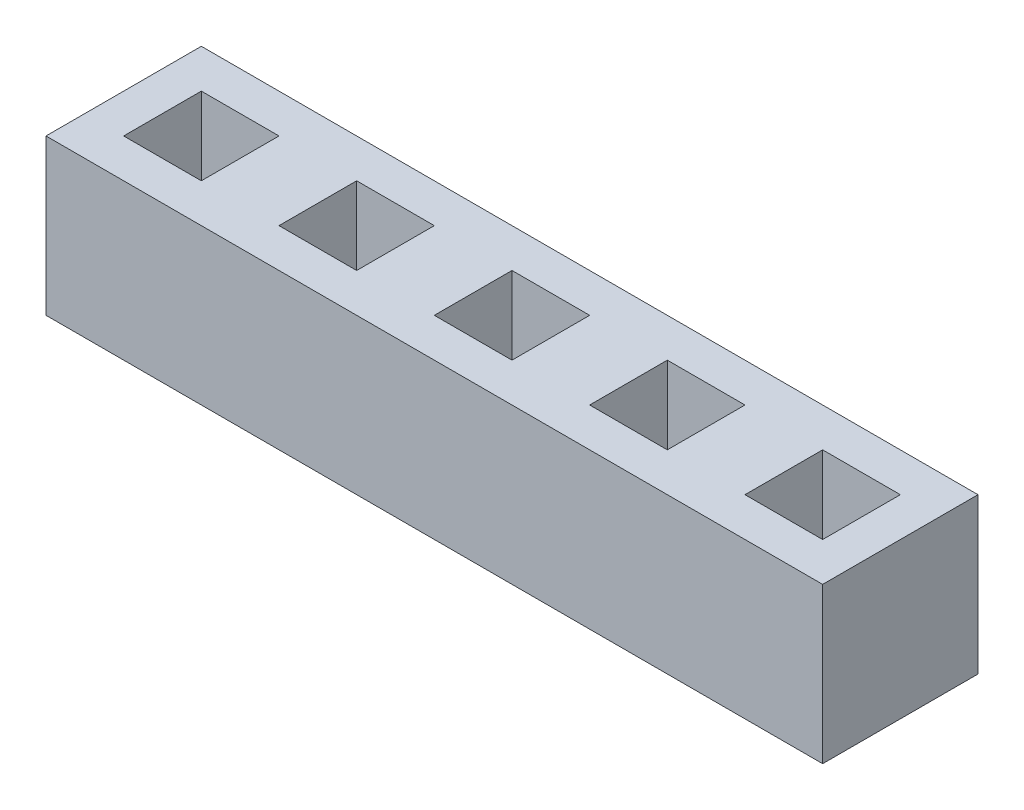
ISO-10303-21;
HEADER;
FILE_DESCRIPTION(('STEP AP214'),'2;1');
FILE_NAME('part.step','',(''),(''),'','','');
FILE_SCHEMA(('AUTOMOTIVE_DESIGN { 1 0 10303 214 1 1 1 1 }'));
ENDSEC;
DATA;
#1=APPLICATION_CONTEXT('core data for automotive mechanical design processes');
#2=APPLICATION_PROTOCOL_DEFINITION('international standard','automotive_design',2000,#1);
#3=PRODUCT_CONTEXT('',#1,'mechanical');
#4=PRODUCT('Part','Part','',(#3));
#5=PRODUCT_RELATED_PRODUCT_CATEGORY('part','',(#4));
#6=PRODUCT_DEFINITION_FORMATION('','',#4);
#7=PRODUCT_DEFINITION_CONTEXT('part definition',#1,'design');
#8=PRODUCT_DEFINITION('design','',#6,#7);
#9=PRODUCT_DEFINITION_SHAPE('','',#8);
#10=(LENGTH_UNIT() NAMED_UNIT(*) SI_UNIT(.MILLI.,.METRE.));
#11=(NAMED_UNIT(*) PLANE_ANGLE_UNIT() SI_UNIT($,.RADIAN.));
#12=(NAMED_UNIT(*) SI_UNIT($,.STERADIAN.) SOLID_ANGLE_UNIT());
#13=UNCERTAINTY_MEASURE_WITH_UNIT(LENGTH_MEASURE(1.E-05),#10,'distance_accuracy_value','');
#14=(GEOMETRIC_REPRESENTATION_CONTEXT(3) GLOBAL_UNCERTAINTY_ASSIGNED_CONTEXT((#13)) GLOBAL_UNIT_ASSIGNED_CONTEXT((#10,
#11,#12)) REPRESENTATION_CONTEXT('',''));
#15=CARTESIAN_POINT('',(0.,0.,0.));
#16=DIRECTION('',(0.,0.,1.));
#17=DIRECTION('',(1.,0.,0.));
#18=AXIS2_PLACEMENT_3D('',#15,#16,#17);
#19=CARTESIAN_POINT('',(0.,2.54,-2.54));
#20=DIRECTION('',(0.,-1.,0.));
#21=DIRECTION('',(0.,0.,-1.));
#22=AXIS2_PLACEMENT_3D('',#19,#20,#21);
#23=PLANE('',#22);
#24=DIRECTION('',(0.,0.,1.));
#25=VECTOR('',#24,1.);
#26=CARTESIAN_POINT('',(8.255,2.54,-1.905));
#27=LINE('',#26,#25);
#28=CARTESIAN_POINT('',(8.255,2.54,-1.905));
#29=VERTEX_POINT('',#28);
#30=CARTESIAN_POINT('',(8.255,2.54,-0.635));
#31=VERTEX_POINT('',#30);
#32=EDGE_CURVE('E229',#29,#31,#27,.T.);
#33=ORIENTED_EDGE('',*,*,#32,.F.);
#34=DIRECTION('',(-1.,0.,0.));
#35=VECTOR('',#34,1.);
#36=CARTESIAN_POINT('',(8.255,2.54,-1.905));
#37=LINE('',#36,#35);
#38=CARTESIAN_POINT('',(9.525,2.54,-1.905));
#39=VERTEX_POINT('',#38);
#40=EDGE_CURVE('E237',#39,#29,#37,.T.);
#41=ORIENTED_EDGE('',*,*,#40,.F.);
#42=DIRECTION('',(0.,0.,-1.));
#43=VECTOR('',#42,1.);
#44=CARTESIAN_POINT('',(9.525,2.54,-1.905));
#45=LINE('',#44,#43);
#46=CARTESIAN_POINT('',(9.525,2.54,-0.635));
#47=VERTEX_POINT('',#46);
#48=EDGE_CURVE('E234',#47,#39,#45,.T.);
#49=ORIENTED_EDGE('',*,*,#48,.F.);
#50=DIRECTION('',(1.,0.,0.));
#51=VECTOR('',#50,1.);
#52=CARTESIAN_POINT('',(8.255,2.54,-0.635));
#53=LINE('',#52,#51);
#54=EDGE_CURVE('E231',#31,#47,#53,.T.);
#55=ORIENTED_EDGE('',*,*,#54,.F.);
#56=EDGE_LOOP('',(#33,#41,#49,#55));
#57=FACE_BOUND('',#56,.T.);
#58=DIRECTION('',(0.,0.,1.));
#59=VECTOR('',#58,1.);
#60=CARTESIAN_POINT('',(3.175,2.54,-1.905));
#61=LINE('',#60,#59);
#62=CARTESIAN_POINT('',(3.175,2.54,-1.905));
#63=VERTEX_POINT('',#62);
#64=CARTESIAN_POINT('',(3.175,2.54,-0.635));
#65=VERTEX_POINT('',#64);
#66=EDGE_CURVE('E291',#63,#65,#61,.T.);
#67=ORIENTED_EDGE('',*,*,#66,.F.);
#68=DIRECTION('',(-1.,0.,0.));
#69=VECTOR('',#68,1.);
#70=CARTESIAN_POINT('',(3.175,2.54,-1.905));
#71=LINE('',#70,#69);
#72=CARTESIAN_POINT('',(4.445,2.54,-1.905));
#73=VERTEX_POINT('',#72);
#74=EDGE_CURVE('E299',#73,#63,#71,.T.);
#75=ORIENTED_EDGE('',*,*,#74,.F.);
#76=DIRECTION('',(0.,0.,-1.));
#77=VECTOR('',#76,1.);
#78=CARTESIAN_POINT('',(4.445,2.54,-1.905));
#79=LINE('',#78,#77);
#80=CARTESIAN_POINT('',(4.445,2.54,-0.635));
#81=VERTEX_POINT('',#80);
#82=EDGE_CURVE('E296',#81,#73,#79,.T.);
#83=ORIENTED_EDGE('',*,*,#82,.F.);
#84=DIRECTION('',(1.,0.,0.));
#85=VECTOR('',#84,1.);
#86=CARTESIAN_POINT('',(3.175,2.54,-0.635));
#87=LINE('',#86,#85);
#88=EDGE_CURVE('E293',#65,#81,#87,.T.);
#89=ORIENTED_EDGE('',*,*,#88,.F.);
#90=EDGE_LOOP('',(#67,#75,#83,#89));
#91=FACE_BOUND('',#90,.T.);
#92=DIRECTION('',(0.,0.,1.));
#93=VECTOR('',#92,1.);
#94=CARTESIAN_POINT('',(0.,2.54,0.));
#95=LINE('',#94,#93);
#96=CARTESIAN_POINT('',(0.,2.54,-2.54));
#97=VERTEX_POINT('',#96);
#98=CARTESIAN_POINT('',(0.,2.54,0.));
#99=VERTEX_POINT('',#98);
#100=EDGE_CURVE('E353',#97,#99,#95,.T.);
#101=ORIENTED_EDGE('',*,*,#100,.T.);
#102=DIRECTION('',(1.,0.,0.));
#103=VECTOR('',#102,1.);
#104=CARTESIAN_POINT('',(0.,2.54,0.));
#105=LINE('',#104,#103);
#106=CARTESIAN_POINT('',(12.7,2.54,0.));
#107=VERTEX_POINT('',#106);
#108=EDGE_CURVE('E356',#99,#107,#105,.T.);
#109=ORIENTED_EDGE('',*,*,#108,.T.);
#110=DIRECTION('',(0.,0.,-1.));
#111=VECTOR('',#110,1.);
#112=CARTESIAN_POINT('',(12.7,2.54,0.));
#113=LINE('',#112,#111);
#114=CARTESIAN_POINT('',(12.7,2.54,-2.54));
#115=VERTEX_POINT('',#114);
#116=EDGE_CURVE('E359',#107,#115,#113,.T.);
#117=ORIENTED_EDGE('',*,*,#116,.T.);
#118=DIRECTION('',(-1.,0.,0.));
#119=VECTOR('',#118,1.);
#120=CARTESIAN_POINT('',(0.,2.54,-2.54));
#121=LINE('',#120,#119);
#122=EDGE_CURVE('E361',#115,#97,#121,.T.);
#123=ORIENTED_EDGE('',*,*,#122,.T.);
#124=EDGE_LOOP('',(#101,#109,#117,#123));
#125=FACE_BOUND('',#124,.T.);
#126=DIRECTION('',(0.,0.,1.));
#127=VECTOR('',#126,1.);
#128=CARTESIAN_POINT('',(0.635,2.54,-1.905));
#129=LINE('',#128,#127);
#130=CARTESIAN_POINT('',(0.635,2.54,-1.905));
#131=VERTEX_POINT('',#130);
#132=CARTESIAN_POINT('',(0.635,2.54,-0.635));
#133=VERTEX_POINT('',#132);
#134=EDGE_CURVE('E322',#131,#133,#129,.T.);
#135=ORIENTED_EDGE('',*,*,#134,.F.);
#136=DIRECTION('',(-1.,0.,0.));
#137=VECTOR('',#136,1.);
#138=CARTESIAN_POINT('',(0.635,2.54,-1.905));
#139=LINE('',#138,#137);
#140=CARTESIAN_POINT('',(1.905,2.54,-1.905));
#141=VERTEX_POINT('',#140);
#142=EDGE_CURVE('E330',#141,#131,#139,.T.);
#143=ORIENTED_EDGE('',*,*,#142,.F.);
#144=DIRECTION('',(0.,0.,-1.));
#145=VECTOR('',#144,1.);
#146=CARTESIAN_POINT('',(1.905,2.54,-1.905));
#147=LINE('',#146,#145);
#148=CARTESIAN_POINT('',(1.905,2.54,-0.635));
#149=VERTEX_POINT('',#148);
#150=EDGE_CURVE('E327',#149,#141,#147,.T.);
#151=ORIENTED_EDGE('',*,*,#150,.F.);
#152=DIRECTION('',(1.,0.,0.));
#153=VECTOR('',#152,1.);
#154=CARTESIAN_POINT('',(0.635,2.54,-0.635));
#155=LINE('',#154,#153);
#156=EDGE_CURVE('E324',#133,#149,#155,.T.);
#157=ORIENTED_EDGE('',*,*,#156,.F.);
#158=EDGE_LOOP('',(#135,#143,#151,#157));
#159=FACE_BOUND('',#158,.T.);
#160=DIRECTION('',(0.,0.,1.));
#161=VECTOR('',#160,1.);
#162=CARTESIAN_POINT('',(5.715,2.54,-1.905));
#163=LINE('',#162,#161);
#164=CARTESIAN_POINT('',(5.715,2.54,-1.905));
#165=VERTEX_POINT('',#164);
#166=CARTESIAN_POINT('',(5.715,2.54,-0.635));
#167=VERTEX_POINT('',#166);
#168=EDGE_CURVE('E260',#165,#167,#163,.T.);
#169=ORIENTED_EDGE('',*,*,#168,.F.);
#170=DIRECTION('',(-1.,0.,0.));
#171=VECTOR('',#170,1.);
#172=CARTESIAN_POINT('',(5.715,2.54,-1.905));
#173=LINE('',#172,#171);
#174=CARTESIAN_POINT('',(6.985,2.54,-1.905));
#175=VERTEX_POINT('',#174);
#176=EDGE_CURVE('E268',#175,#165,#173,.T.);
#177=ORIENTED_EDGE('',*,*,#176,.F.);
#178=DIRECTION('',(0.,0.,-1.));
#179=VECTOR('',#178,1.);
#180=CARTESIAN_POINT('',(6.985,2.54,-1.905));
#181=LINE('',#180,#179);
#182=CARTESIAN_POINT('',(6.985,2.54,-0.635));
#183=VERTEX_POINT('',#182);
#184=EDGE_CURVE('E265',#183,#175,#181,.T.);
#185=ORIENTED_EDGE('',*,*,#184,.F.);
#186=DIRECTION('',(1.,0.,0.));
#187=VECTOR('',#186,1.);
#188=CARTESIAN_POINT('',(5.715,2.54,-0.635));
#189=LINE('',#188,#187);
#190=EDGE_CURVE('E262',#167,#183,#189,.T.);
#191=ORIENTED_EDGE('',*,*,#190,.F.);
#192=EDGE_LOOP('',(#169,#177,#185,#191));
#193=FACE_BOUND('',#192,.T.);
#194=DIRECTION('',(0.,0.,1.));
#195=VECTOR('',#194,1.);
#196=CARTESIAN_POINT('',(10.795,2.54,-1.905));
#197=LINE('',#196,#195);
#198=CARTESIAN_POINT('',(10.795,2.54,-1.905));
#199=VERTEX_POINT('',#198);
#200=CARTESIAN_POINT('',(10.795,2.54,-0.635));
#201=VERTEX_POINT('',#200);
#202=EDGE_CURVE('E193',#199,#201,#197,.T.);
#203=ORIENTED_EDGE('',*,*,#202,.F.);
#204=DIRECTION('',(-1.,0.,0.));
#205=VECTOR('',#204,1.);
#206=CARTESIAN_POINT('',(10.795,2.54,-1.905));
#207=LINE('',#206,#205);
#208=CARTESIAN_POINT('',(12.065,2.54,-1.905));
#209=VERTEX_POINT('',#208);
#210=EDGE_CURVE('E215',#209,#199,#207,.T.);
#211=ORIENTED_EDGE('',*,*,#210,.F.);
#212=DIRECTION('',(0.,0.,-1.));
#213=VECTOR('',#212,1.);
#214=CARTESIAN_POINT('',(12.065,2.54,-1.905));
#215=LINE('',#214,#213);
#216=CARTESIAN_POINT('',(12.065,2.54,-0.635));
#217=VERTEX_POINT('',#216);
#218=EDGE_CURVE('E213',#217,#209,#215,.T.);
#219=ORIENTED_EDGE('',*,*,#218,.F.);
#220=DIRECTION('',(1.,0.,0.));
#221=VECTOR('',#220,1.);
#222=CARTESIAN_POINT('',(10.795,2.54,-0.635));
#223=LINE('',#222,#221);
#224=EDGE_CURVE('E201',#201,#217,#223,.T.);
#225=ORIENTED_EDGE('',*,*,#224,.F.);
#226=EDGE_LOOP('',(#203,#211,#219,#225));
#227=FACE_BOUND('',#226,.T.);
#228=ADVANCED_FACE('F32',(#57,#91,#125,#159,#193,#227),#23,.F.);
#229=CARTESIAN_POINT('',(0.,0.,-2.54));
#230=DIRECTION('',(0.,-1.,0.));
#231=DIRECTION('',(0.,0.,-1.));
#232=AXIS2_PLACEMENT_3D('',#229,#230,#231);
#233=PLANE('',#232);
#234=DIRECTION('',(-1.,0.,0.));
#235=VECTOR('',#234,1.);
#236=CARTESIAN_POINT('',(8.255,0.,-1.905));
#237=LINE('',#236,#235);
#238=CARTESIAN_POINT('',(9.525,0.,-1.905));
#239=VERTEX_POINT('',#238);
#240=CARTESIAN_POINT('',(8.255,0.,-1.905));
#241=VERTEX_POINT('',#240);
#242=EDGE_CURVE('E232',#239,#241,#237,.T.);
#243=ORIENTED_EDGE('',*,*,#242,.T.);
#244=DIRECTION('',(0.,0.,1.));
#245=VECTOR('',#244,1.);
#246=CARTESIAN_POINT('',(8.255,0.,-1.905));
#247=LINE('',#246,#245);
#248=CARTESIAN_POINT('',(8.255,0.,-0.635));
#249=VERTEX_POINT('',#248);
#250=EDGE_CURVE('E209',#241,#249,#247,.T.);
#251=ORIENTED_EDGE('',*,*,#250,.T.);
#252=DIRECTION('',(1.,0.,0.));
#253=VECTOR('',#252,1.);
#254=CARTESIAN_POINT('',(8.255,0.,-0.635));
#255=LINE('',#254,#253);
#256=CARTESIAN_POINT('',(9.525,0.,-0.635));
#257=VERTEX_POINT('',#256);
#258=EDGE_CURVE('E242',#249,#257,#255,.T.);
#259=ORIENTED_EDGE('',*,*,#258,.T.);
#260=DIRECTION('',(0.,0.,-1.));
#261=VECTOR('',#260,1.);
#262=CARTESIAN_POINT('',(9.525,0.,-1.905));
#263=LINE('',#262,#261);
#264=EDGE_CURVE('E245',#257,#239,#263,.T.);
#265=ORIENTED_EDGE('',*,*,#264,.T.);
#266=EDGE_LOOP('',(#243,#251,#259,#265));
#267=FACE_BOUND('',#266,.T.);
#268=DIRECTION('',(-1.,0.,0.));
#269=VECTOR('',#268,1.);
#270=CARTESIAN_POINT('',(3.175,0.,-1.905));
#271=LINE('',#270,#269);
#272=CARTESIAN_POINT('',(4.445,0.,-1.905));
#273=VERTEX_POINT('',#272);
#274=CARTESIAN_POINT('',(3.175,0.,-1.905));
#275=VERTEX_POINT('',#274);
#276=EDGE_CURVE('E294',#273,#275,#271,.T.);
#277=ORIENTED_EDGE('',*,*,#276,.T.);
#278=DIRECTION('',(0.,0.,1.));
#279=VECTOR('',#278,1.);
#280=CARTESIAN_POINT('',(3.175,0.,-1.905));
#281=LINE('',#280,#279);
#282=CARTESIAN_POINT('',(3.175,0.,-0.635));
#283=VERTEX_POINT('',#282);
#284=EDGE_CURVE('E290',#275,#283,#281,.T.);
#285=ORIENTED_EDGE('',*,*,#284,.T.);
#286=DIRECTION('',(1.,0.,0.));
#287=VECTOR('',#286,1.);
#288=CARTESIAN_POINT('',(3.175,0.,-0.635));
#289=LINE('',#288,#287);
#290=CARTESIAN_POINT('',(4.445,0.,-0.635));
#291=VERTEX_POINT('',#290);
#292=EDGE_CURVE('E304',#283,#291,#289,.T.);
#293=ORIENTED_EDGE('',*,*,#292,.T.);
#294=DIRECTION('',(0.,0.,-1.));
#295=VECTOR('',#294,1.);
#296=CARTESIAN_POINT('',(4.445,0.,-1.905));
#297=LINE('',#296,#295);
#298=EDGE_CURVE('E307',#291,#273,#297,.T.);
#299=ORIENTED_EDGE('',*,*,#298,.T.);
#300=EDGE_LOOP('',(#277,#285,#293,#299));
#301=FACE_BOUND('',#300,.T.);
#302=DIRECTION('',(0.,0.,1.));
#303=VECTOR('',#302,1.);
#304=CARTESIAN_POINT('',(0.,0.,0.));
#305=LINE('',#304,#303);
#306=CARTESIAN_POINT('',(0.,0.,-2.54));
#307=VERTEX_POINT('',#306);
#308=CARTESIAN_POINT('',(0.,0.,0.));
#309=VERTEX_POINT('',#308);
#310=EDGE_CURVE('E352',#307,#309,#305,.T.);
#311=ORIENTED_EDGE('',*,*,#310,.F.);
#312=DIRECTION('',(-1.,0.,0.));
#313=VECTOR('',#312,1.);
#314=CARTESIAN_POINT('',(0.,0.,-2.54));
#315=LINE('',#314,#313);
#316=CARTESIAN_POINT('',(12.7,0.,-2.54));
#317=VERTEX_POINT('',#316);
#318=EDGE_CURVE('E357',#317,#307,#315,.T.);
#319=ORIENTED_EDGE('',*,*,#318,.F.);
#320=DIRECTION('',(0.,0.,-1.));
#321=VECTOR('',#320,1.);
#322=CARTESIAN_POINT('',(12.7,0.,0.));
#323=LINE('',#322,#321);
#324=CARTESIAN_POINT('',(12.7,0.,0.));
#325=VERTEX_POINT('',#324);
#326=EDGE_CURVE('E368',#325,#317,#323,.T.);
#327=ORIENTED_EDGE('',*,*,#326,.F.);
#328=DIRECTION('',(1.,0.,0.));
#329=VECTOR('',#328,1.);
#330=CARTESIAN_POINT('',(0.,0.,0.));
#331=LINE('',#330,#329);
#332=EDGE_CURVE('E366',#309,#325,#331,.T.);
#333=ORIENTED_EDGE('',*,*,#332,.F.);
#334=EDGE_LOOP('',(#311,#319,#327,#333));
#335=FACE_BOUND('',#334,.T.);
#336=DIRECTION('',(-1.,0.,0.));
#337=VECTOR('',#336,1.);
#338=CARTESIAN_POINT('',(0.635,0.,-1.905));
#339=LINE('',#338,#337);
#340=CARTESIAN_POINT('',(1.905,0.,-1.905));
#341=VERTEX_POINT('',#340);
#342=CARTESIAN_POINT('',(0.635,0.,-1.905));
#343=VERTEX_POINT('',#342);
#344=EDGE_CURVE('E325',#341,#343,#339,.T.);
#345=ORIENTED_EDGE('',*,*,#344,.T.);
#346=DIRECTION('',(0.,0.,1.));
#347=VECTOR('',#346,1.);
#348=CARTESIAN_POINT('',(0.635,0.,-1.905));
#349=LINE('',#348,#347);
#350=CARTESIAN_POINT('',(0.635,0.,-0.635));
#351=VERTEX_POINT('',#350);
#352=EDGE_CURVE('E321',#343,#351,#349,.T.);
#353=ORIENTED_EDGE('',*,*,#352,.T.);
#354=DIRECTION('',(1.,0.,0.));
#355=VECTOR('',#354,1.);
#356=CARTESIAN_POINT('',(0.635,0.,-0.635));
#357=LINE('',#356,#355);
#358=CARTESIAN_POINT('',(1.905,0.,-0.635));
#359=VERTEX_POINT('',#358);
#360=EDGE_CURVE('E335',#351,#359,#357,.T.);
#361=ORIENTED_EDGE('',*,*,#360,.T.);
#362=DIRECTION('',(0.,0.,-1.));
#363=VECTOR('',#362,1.);
#364=CARTESIAN_POINT('',(1.905,0.,-1.905));
#365=LINE('',#364,#363);
#366=EDGE_CURVE('E338',#359,#341,#365,.T.);
#367=ORIENTED_EDGE('',*,*,#366,.T.);
#368=EDGE_LOOP('',(#345,#353,#361,#367));
#369=FACE_BOUND('',#368,.T.);
#370=DIRECTION('',(-1.,0.,0.));
#371=VECTOR('',#370,1.);
#372=CARTESIAN_POINT('',(5.715,0.,-1.905));
#373=LINE('',#372,#371);
#374=CARTESIAN_POINT('',(6.985,0.,-1.905));
#375=VERTEX_POINT('',#374);
#376=CARTESIAN_POINT('',(5.715,0.,-1.905));
#377=VERTEX_POINT('',#376);
#378=EDGE_CURVE('E263',#375,#377,#373,.T.);
#379=ORIENTED_EDGE('',*,*,#378,.T.);
#380=DIRECTION('',(0.,0.,1.));
#381=VECTOR('',#380,1.);
#382=CARTESIAN_POINT('',(5.715,0.,-1.905));
#383=LINE('',#382,#381);
#384=CARTESIAN_POINT('',(5.715,0.,-0.635));
#385=VERTEX_POINT('',#384);
#386=EDGE_CURVE('E259',#377,#385,#383,.T.);
#387=ORIENTED_EDGE('',*,*,#386,.T.);
#388=DIRECTION('',(1.,0.,0.));
#389=VECTOR('',#388,1.);
#390=CARTESIAN_POINT('',(5.715,0.,-0.635));
#391=LINE('',#390,#389);
#392=CARTESIAN_POINT('',(6.985,0.,-0.635));
#393=VERTEX_POINT('',#392);
#394=EDGE_CURVE('E273',#385,#393,#391,.T.);
#395=ORIENTED_EDGE('',*,*,#394,.T.);
#396=DIRECTION('',(0.,0.,-1.));
#397=VECTOR('',#396,1.);
#398=CARTESIAN_POINT('',(6.985,0.,-1.905));
#399=LINE('',#398,#397);
#400=EDGE_CURVE('E276',#393,#375,#399,.T.);
#401=ORIENTED_EDGE('',*,*,#400,.T.);
#402=EDGE_LOOP('',(#379,#387,#395,#401));
#403=FACE_BOUND('',#402,.T.);
#404=DIRECTION('',(-1.,0.,0.));
#405=VECTOR('',#404,1.);
#406=CARTESIAN_POINT('',(10.795,0.,-1.905));
#407=LINE('',#406,#405);
#408=CARTESIAN_POINT('',(12.065,0.,-1.905));
#409=VERTEX_POINT('',#408);
#410=CARTESIAN_POINT('',(10.795,0.,-1.905));
#411=VERTEX_POINT('',#410);
#412=EDGE_CURVE('E202',#409,#411,#407,.T.);
#413=ORIENTED_EDGE('',*,*,#412,.T.);
#414=DIRECTION('',(0.,0.,1.));
#415=VECTOR('',#414,1.);
#416=CARTESIAN_POINT('',(10.795,0.,-1.905));
#417=LINE('',#416,#415);
#418=CARTESIAN_POINT('',(10.795,0.,-0.635));
#419=VERTEX_POINT('',#418);
#420=EDGE_CURVE('E55',#411,#419,#417,.T.);
#421=ORIENTED_EDGE('',*,*,#420,.T.);
#422=DIRECTION('',(1.,0.,0.));
#423=VECTOR('',#422,1.);
#424=CARTESIAN_POINT('',(10.795,0.,-0.635));
#425=LINE('',#424,#423);
#426=CARTESIAN_POINT('',(12.065,0.,-0.635));
#427=VERTEX_POINT('',#426);
#428=EDGE_CURVE('E208',#419,#427,#425,.T.);
#429=ORIENTED_EDGE('',*,*,#428,.T.);
#430=DIRECTION('',(0.,0.,-1.));
#431=VECTOR('',#430,1.);
#432=CARTESIAN_POINT('',(12.065,0.,-1.905));
#433=LINE('',#432,#431);
#434=EDGE_CURVE('E221',#427,#409,#433,.T.);
#435=ORIENTED_EDGE('',*,*,#434,.T.);
#436=EDGE_LOOP('',(#413,#421,#429,#435));
#437=FACE_BOUND('',#436,.T.);
#438=ADVANCED_FACE('F386',(#267,#301,#335,#369,#403,#437),#233,.T.);
#439=CARTESIAN_POINT('',(0.,2.54,0.));
#440=DIRECTION('',(1.,0.,0.));
#441=DIRECTION('',(0.,0.,-1.));
#442=AXIS2_PLACEMENT_3D('',#439,#440,#441);
#443=PLANE('',#442);
#444=ORIENTED_EDGE('',*,*,#310,.T.);
#445=DIRECTION('',(0.,-1.,0.));
#446=VECTOR('',#445,1.);
#447=CARTESIAN_POINT('',(0.,2.54,0.));
#448=LINE('',#447,#446);
#449=EDGE_CURVE('E11',#99,#309,#448,.T.);
#450=ORIENTED_EDGE('',*,*,#449,.F.);
#451=ORIENTED_EDGE('',*,*,#100,.F.);
#452=DIRECTION('',(0.,-1.,0.));
#453=VECTOR('',#452,1.);
#454=CARTESIAN_POINT('',(0.,2.54,-2.54));
#455=LINE('',#454,#453);
#456=EDGE_CURVE('E363',#97,#307,#455,.T.);
#457=ORIENTED_EDGE('',*,*,#456,.T.);
#458=EDGE_LOOP('',(#444,#450,#451,#457));
#459=FACE_BOUND('',#458,.T.);
#460=ADVANCED_FACE('F34',(#459),#443,.F.);
#461=CARTESIAN_POINT('',(0.,2.54,0.));
#462=DIRECTION('',(0.,0.,-1.));
#463=DIRECTION('',(-1.,0.,0.));
#464=AXIS2_PLACEMENT_3D('',#461,#462,#463);
#465=PLANE('',#464);
#466=ORIENTED_EDGE('',*,*,#332,.T.);
#467=DIRECTION('',(0.,-1.,0.));
#468=VECTOR('',#467,1.);
#469=CARTESIAN_POINT('',(12.7,2.54,0.));
#470=LINE('',#469,#468);
#471=EDGE_CURVE('E40',#107,#325,#470,.T.);
#472=ORIENTED_EDGE('',*,*,#471,.F.);
#473=ORIENTED_EDGE('',*,*,#108,.F.);
#474=ORIENTED_EDGE('',*,*,#449,.T.);
#475=EDGE_LOOP('',(#466,#472,#473,#474));
#476=FACE_BOUND('',#475,.T.);
#477=ADVANCED_FACE('F397',(#476),#465,.F.);
#478=CARTESIAN_POINT('',(12.7,2.54,0.));
#479=DIRECTION('',(-1.,0.,0.));
#480=DIRECTION('',(0.,0.,1.));
#481=AXIS2_PLACEMENT_3D('',#478,#479,#480);
#482=PLANE('',#481);
#483=ORIENTED_EDGE('',*,*,#326,.T.);
#484=DIRECTION('',(0.,-1.,0.));
#485=VECTOR('',#484,1.);
#486=CARTESIAN_POINT('',(12.7,2.54,-2.54));
#487=LINE('',#486,#485);
#488=EDGE_CURVE('E373',#115,#317,#487,.T.);
#489=ORIENTED_EDGE('',*,*,#488,.F.);
#490=ORIENTED_EDGE('',*,*,#116,.F.);
#491=ORIENTED_EDGE('',*,*,#471,.T.);
#492=EDGE_LOOP('',(#483,#489,#490,#491));
#493=FACE_BOUND('',#492,.T.);
#494=ADVANCED_FACE('F380',(#493),#482,.F.);
#495=CARTESIAN_POINT('',(0.,2.54,-2.54));
#496=DIRECTION('',(0.,0.,1.));
#497=DIRECTION('',(1.,0.,0.));
#498=AXIS2_PLACEMENT_3D('',#495,#496,#497);
#499=PLANE('',#498);
#500=ORIENTED_EDGE('',*,*,#318,.T.);
#501=ORIENTED_EDGE('',*,*,#456,.F.);
#502=ORIENTED_EDGE('',*,*,#122,.F.);
#503=ORIENTED_EDGE('',*,*,#488,.T.);
#504=EDGE_LOOP('',(#500,#501,#502,#503));
#505=FACE_BOUND('',#504,.T.);
#506=ADVANCED_FACE('F390',(#505),#499,.F.);
#507=CARTESIAN_POINT('',(0.635,2.54,-1.905));
#508=DIRECTION('',(1.,0.,0.));
#509=DIRECTION('',(0.,0.,-1.));
#510=AXIS2_PLACEMENT_3D('',#507,#508,#509);
#511=PLANE('',#510);
#512=ORIENTED_EDGE('',*,*,#352,.F.);
#513=DIRECTION('',(0.,-1.,0.));
#514=VECTOR('',#513,1.);
#515=CARTESIAN_POINT('',(0.635,2.54,-1.905));
#516=LINE('',#515,#514);
#517=EDGE_CURVE('E332',#131,#343,#516,.T.);
#518=ORIENTED_EDGE('',*,*,#517,.F.);
#519=ORIENTED_EDGE('',*,*,#134,.T.);
#520=DIRECTION('',(0.,-1.,0.));
#521=VECTOR('',#520,1.);
#522=CARTESIAN_POINT('',(0.635,2.54,-0.635));
#523=LINE('',#522,#521);
#524=EDGE_CURVE('E349',#133,#351,#523,.T.);
#525=ORIENTED_EDGE('',*,*,#524,.T.);
#526=EDGE_LOOP('',(#512,#518,#519,#525));
#527=FACE_BOUND('',#526,.T.);
#528=ADVANCED_FACE('F415',(#527),#511,.T.);
#529=CARTESIAN_POINT('',(0.635,2.54,-0.635));
#530=DIRECTION('',(0.,0.,-1.));
#531=DIRECTION('',(-1.,0.,0.));
#532=AXIS2_PLACEMENT_3D('',#529,#530,#531);
#533=PLANE('',#532);
#534=ORIENTED_EDGE('',*,*,#360,.F.);
#535=ORIENTED_EDGE('',*,*,#524,.F.);
#536=ORIENTED_EDGE('',*,*,#156,.T.);
#537=DIRECTION('',(0.,-1.,0.));
#538=VECTOR('',#537,1.);
#539=CARTESIAN_POINT('',(1.905,2.54,-0.635));
#540=LINE('',#539,#538);
#541=EDGE_CURVE('E347',#149,#359,#540,.T.);
#542=ORIENTED_EDGE('',*,*,#541,.T.);
#543=EDGE_LOOP('',(#534,#535,#536,#542));
#544=FACE_BOUND('',#543,.T.);
#545=ADVANCED_FACE('F422',(#544),#533,.T.);
#546=CARTESIAN_POINT('',(1.905,2.54,-1.905));
#547=DIRECTION('',(-1.,0.,0.));
#548=DIRECTION('',(0.,0.,1.));
#549=AXIS2_PLACEMENT_3D('',#546,#547,#548);
#550=PLANE('',#549);
#551=ORIENTED_EDGE('',*,*,#366,.F.);
#552=ORIENTED_EDGE('',*,*,#541,.F.);
#553=ORIENTED_EDGE('',*,*,#150,.T.);
#554=DIRECTION('',(0.,-1.,0.));
#555=VECTOR('',#554,1.);
#556=CARTESIAN_POINT('',(1.905,2.54,-1.905));
#557=LINE('',#556,#555);
#558=EDGE_CURVE('E345',#141,#341,#557,.T.);
#559=ORIENTED_EDGE('',*,*,#558,.T.);
#560=EDGE_LOOP('',(#551,#552,#553,#559));
#561=FACE_BOUND('',#560,.T.);
#562=ADVANCED_FACE('F427',(#561),#550,.T.);
#563=CARTESIAN_POINT('',(0.635,2.54,-1.905));
#564=DIRECTION('',(0.,0.,1.));
#565=DIRECTION('',(1.,0.,0.));
#566=AXIS2_PLACEMENT_3D('',#563,#564,#565);
#567=PLANE('',#566);
#568=ORIENTED_EDGE('',*,*,#344,.F.);
#569=ORIENTED_EDGE('',*,*,#558,.F.);
#570=ORIENTED_EDGE('',*,*,#142,.T.);
#571=ORIENTED_EDGE('',*,*,#517,.T.);
#572=EDGE_LOOP('',(#568,#569,#570,#571));
#573=FACE_BOUND('',#572,.T.);
#574=ADVANCED_FACE('F434',(#573),#567,.T.);
#575=CARTESIAN_POINT('',(3.175,2.54,-1.905));
#576=DIRECTION('',(1.,0.,0.));
#577=DIRECTION('',(0.,0.,-1.));
#578=AXIS2_PLACEMENT_3D('',#575,#576,#577);
#579=PLANE('',#578);
#580=ORIENTED_EDGE('',*,*,#284,.F.);
#581=DIRECTION('',(0.,-1.,0.));
#582=VECTOR('',#581,1.);
#583=CARTESIAN_POINT('',(3.175,2.54,-1.905));
#584=LINE('',#583,#582);
#585=EDGE_CURVE('E301',#63,#275,#584,.T.);
#586=ORIENTED_EDGE('',*,*,#585,.F.);
#587=ORIENTED_EDGE('',*,*,#66,.T.);
#588=DIRECTION('',(0.,-1.,0.));
#589=VECTOR('',#588,1.);
#590=CARTESIAN_POINT('',(3.175,2.54,-0.635));
#591=LINE('',#590,#589);
#592=EDGE_CURVE('E318',#65,#283,#591,.T.);
#593=ORIENTED_EDGE('',*,*,#592,.T.);
#594=EDGE_LOOP('',(#580,#586,#587,#593));
#595=FACE_BOUND('',#594,.T.);
#596=ADVANCED_FACE('F485',(#595),#579,.T.);
#597=CARTESIAN_POINT('',(3.175,2.54,-0.635));
#598=DIRECTION('',(0.,0.,-1.));
#599=DIRECTION('',(-1.,0.,0.));
#600=AXIS2_PLACEMENT_3D('',#597,#598,#599);
#601=PLANE('',#600);
#602=ORIENTED_EDGE('',*,*,#292,.F.);
#603=ORIENTED_EDGE('',*,*,#592,.F.);
#604=ORIENTED_EDGE('',*,*,#88,.T.);
#605=DIRECTION('',(0.,-1.,0.));
#606=VECTOR('',#605,1.);
#607=CARTESIAN_POINT('',(4.445,2.54,-0.635));
#608=LINE('',#607,#606);
#609=EDGE_CURVE('E316',#81,#291,#608,.T.);
#610=ORIENTED_EDGE('',*,*,#609,.T.);
#611=EDGE_LOOP('',(#602,#603,#604,#610));
#612=FACE_BOUND('',#611,.T.);
#613=ADVANCED_FACE('F481',(#612),#601,.T.);
#614=CARTESIAN_POINT('',(4.445,2.54,-1.905));
#615=DIRECTION('',(-1.,0.,0.));
#616=DIRECTION('',(0.,0.,1.));
#617=AXIS2_PLACEMENT_3D('',#614,#615,#616);
#618=PLANE('',#617);
#619=ORIENTED_EDGE('',*,*,#298,.F.);
#620=ORIENTED_EDGE('',*,*,#609,.F.);
#621=ORIENTED_EDGE('',*,*,#82,.T.);
#622=DIRECTION('',(0.,-1.,0.));
#623=VECTOR('',#622,1.);
#624=CARTESIAN_POINT('',(4.445,2.54,-1.905));
#625=LINE('',#624,#623);
#626=EDGE_CURVE('E314',#73,#273,#625,.T.);
#627=ORIENTED_EDGE('',*,*,#626,.T.);
#628=EDGE_LOOP('',(#619,#620,#621,#627));
#629=FACE_BOUND('',#628,.T.);
#630=ADVANCED_FACE('F477',(#629),#618,.T.);
#631=CARTESIAN_POINT('',(3.175,2.54,-1.905));
#632=DIRECTION('',(0.,0.,1.));
#633=DIRECTION('',(1.,0.,0.));
#634=AXIS2_PLACEMENT_3D('',#631,#632,#633);
#635=PLANE('',#634);
#636=ORIENTED_EDGE('',*,*,#276,.F.);
#637=ORIENTED_EDGE('',*,*,#626,.F.);
#638=ORIENTED_EDGE('',*,*,#74,.T.);
#639=ORIENTED_EDGE('',*,*,#585,.T.);
#640=EDGE_LOOP('',(#636,#637,#638,#639));
#641=FACE_BOUND('',#640,.T.);
#642=ADVANCED_FACE('F474',(#641),#635,.T.);
#643=CARTESIAN_POINT('',(5.715,2.54,-1.905));
#644=DIRECTION('',(1.,0.,0.));
#645=DIRECTION('',(0.,0.,-1.));
#646=AXIS2_PLACEMENT_3D('',#643,#644,#645);
#647=PLANE('',#646);
#648=ORIENTED_EDGE('',*,*,#386,.F.);
#649=DIRECTION('',(0.,-1.,0.));
#650=VECTOR('',#649,1.);
#651=CARTESIAN_POINT('',(5.715,2.54,-1.905));
#652=LINE('',#651,#650);
#653=EDGE_CURVE('E270',#165,#377,#652,.T.);
#654=ORIENTED_EDGE('',*,*,#653,.F.);
#655=ORIENTED_EDGE('',*,*,#168,.T.);
#656=DIRECTION('',(0.,-1.,0.));
#657=VECTOR('',#656,1.);
#658=CARTESIAN_POINT('',(5.715,2.54,-0.635));
#659=LINE('',#658,#657);
#660=EDGE_CURVE('E287',#167,#385,#659,.T.);
#661=ORIENTED_EDGE('',*,*,#660,.T.);
#662=EDGE_LOOP('',(#648,#654,#655,#661));
#663=FACE_BOUND('',#662,.T.);
#664=ADVANCED_FACE('F450',(#663),#647,.T.);
#665=CARTESIAN_POINT('',(5.715,2.54,-0.635));
#666=DIRECTION('',(0.,0.,-1.));
#667=DIRECTION('',(-1.,0.,0.));
#668=AXIS2_PLACEMENT_3D('',#665,#666,#667);
#669=PLANE('',#668);
#670=ORIENTED_EDGE('',*,*,#394,.F.);
#671=ORIENTED_EDGE('',*,*,#660,.F.);
#672=ORIENTED_EDGE('',*,*,#190,.T.);
#673=DIRECTION('',(0.,-1.,0.));
#674=VECTOR('',#673,1.);
#675=CARTESIAN_POINT('',(6.985,2.54,-0.635));
#676=LINE('',#675,#674);
#677=EDGE_CURVE('E285',#183,#393,#676,.T.);
#678=ORIENTED_EDGE('',*,*,#677,.T.);
#679=EDGE_LOOP('',(#670,#671,#672,#678));
#680=FACE_BOUND('',#679,.T.);
#681=ADVANCED_FACE('F452',(#680),#669,.T.);
#682=CARTESIAN_POINT('',(6.985,2.54,-1.905));
#683=DIRECTION('',(-1.,0.,0.));
#684=DIRECTION('',(0.,0.,1.));
#685=AXIS2_PLACEMENT_3D('',#682,#683,#684);
#686=PLANE('',#685);
#687=ORIENTED_EDGE('',*,*,#400,.F.);
#688=ORIENTED_EDGE('',*,*,#677,.F.);
#689=ORIENTED_EDGE('',*,*,#184,.T.);
#690=DIRECTION('',(0.,-1.,0.));
#691=VECTOR('',#690,1.);
#692=CARTESIAN_POINT('',(6.985,2.54,-1.905));
#693=LINE('',#692,#691);
#694=EDGE_CURVE('E283',#175,#375,#693,.T.);
#695=ORIENTED_EDGE('',*,*,#694,.T.);
#696=EDGE_LOOP('',(#687,#688,#689,#695));
#697=FACE_BOUND('',#696,.T.);
#698=ADVANCED_FACE('F460',(#697),#686,.T.);
#699=CARTESIAN_POINT('',(5.715,2.54,-1.905));
#700=DIRECTION('',(0.,0.,1.));
#701=DIRECTION('',(1.,0.,0.));
#702=AXIS2_PLACEMENT_3D('',#699,#700,#701);
#703=PLANE('',#702);
#704=ORIENTED_EDGE('',*,*,#378,.F.);
#705=ORIENTED_EDGE('',*,*,#694,.F.);
#706=ORIENTED_EDGE('',*,*,#176,.T.);
#707=ORIENTED_EDGE('',*,*,#653,.T.);
#708=EDGE_LOOP('',(#704,#705,#706,#707));
#709=FACE_BOUND('',#708,.T.);
#710=ADVANCED_FACE('F458',(#709),#703,.T.);
#711=CARTESIAN_POINT('',(8.255,2.54,-1.905));
#712=DIRECTION('',(1.,0.,0.));
#713=DIRECTION('',(0.,0.,-1.));
#714=AXIS2_PLACEMENT_3D('',#711,#712,#713);
#715=PLANE('',#714);
#716=ORIENTED_EDGE('',*,*,#250,.F.);
#717=DIRECTION('',(0.,-1.,0.));
#718=VECTOR('',#717,1.);
#719=CARTESIAN_POINT('',(8.255,2.54,-1.905));
#720=LINE('',#719,#718);
#721=EDGE_CURVE('E239',#29,#241,#720,.T.);
#722=ORIENTED_EDGE('',*,*,#721,.F.);
#723=ORIENTED_EDGE('',*,*,#32,.T.);
#724=DIRECTION('',(0.,-1.,0.));
#725=VECTOR('',#724,1.);
#726=CARTESIAN_POINT('',(8.255,2.54,-0.635));
#727=LINE('',#726,#725);
#728=EDGE_CURVE('E256',#31,#249,#727,.T.);
#729=ORIENTED_EDGE('',*,*,#728,.T.);
#730=EDGE_LOOP('',(#716,#722,#723,#729));
#731=FACE_BOUND('',#730,.T.);
#732=ADVANCED_FACE('F467',(#731),#715,.T.);
#733=CARTESIAN_POINT('',(8.255,2.54,-0.635));
#734=DIRECTION('',(0.,0.,-1.));
#735=DIRECTION('',(-1.,0.,0.));
#736=AXIS2_PLACEMENT_3D('',#733,#734,#735);
#737=PLANE('',#736);
#738=ORIENTED_EDGE('',*,*,#258,.F.);
#739=ORIENTED_EDGE('',*,*,#728,.F.);
#740=ORIENTED_EDGE('',*,*,#54,.T.);
#741=DIRECTION('',(0.,-1.,0.));
#742=VECTOR('',#741,1.);
#743=CARTESIAN_POINT('',(9.525,2.54,-0.635));
#744=LINE('',#743,#742);
#745=EDGE_CURVE('E254',#47,#257,#744,.T.);
#746=ORIENTED_EDGE('',*,*,#745,.T.);
#747=EDGE_LOOP('',(#738,#739,#740,#746));
#748=FACE_BOUND('',#747,.T.);
#749=ADVANCED_FACE('F544',(#748),#737,.T.);
#750=CARTESIAN_POINT('',(9.525,2.54,-1.905));
#751=DIRECTION('',(-1.,0.,0.));
#752=DIRECTION('',(0.,0.,1.));
#753=AXIS2_PLACEMENT_3D('',#750,#751,#752);
#754=PLANE('',#753);
#755=ORIENTED_EDGE('',*,*,#264,.F.);
#756=ORIENTED_EDGE('',*,*,#745,.F.);
#757=ORIENTED_EDGE('',*,*,#48,.T.);
#758=DIRECTION('',(0.,-1.,0.));
#759=VECTOR('',#758,1.);
#760=CARTESIAN_POINT('',(9.525,2.54,-1.905));
#761=LINE('',#760,#759);
#762=EDGE_CURVE('E252',#39,#239,#761,.T.);
#763=ORIENTED_EDGE('',*,*,#762,.T.);
#764=EDGE_LOOP('',(#755,#756,#757,#763));
#765=FACE_BOUND('',#764,.T.);
#766=ADVANCED_FACE('F553',(#765),#754,.T.);
#767=CARTESIAN_POINT('',(8.255,2.54,-1.905));
#768=DIRECTION('',(0.,0.,1.));
#769=DIRECTION('',(1.,0.,0.));
#770=AXIS2_PLACEMENT_3D('',#767,#768,#769);
#771=PLANE('',#770);
#772=ORIENTED_EDGE('',*,*,#242,.F.);
#773=ORIENTED_EDGE('',*,*,#762,.F.);
#774=ORIENTED_EDGE('',*,*,#40,.T.);
#775=ORIENTED_EDGE('',*,*,#721,.T.);
#776=EDGE_LOOP('',(#772,#773,#774,#775));
#777=FACE_BOUND('',#776,.T.);
#778=ADVANCED_FACE('F563',(#777),#771,.T.);
#779=CARTESIAN_POINT('',(10.795,2.54,-1.905));
#780=DIRECTION('',(1.,0.,0.));
#781=DIRECTION('',(0.,0.,-1.));
#782=AXIS2_PLACEMENT_3D('',#779,#780,#781);
#783=PLANE('',#782);
#784=ORIENTED_EDGE('',*,*,#420,.F.);
#785=DIRECTION('',(0.,-1.,0.));
#786=VECTOR('',#785,1.);
#787=CARTESIAN_POINT('',(10.795,2.54,-1.905));
#788=LINE('',#787,#786);
#789=EDGE_CURVE('E197',#199,#411,#788,.T.);
#790=ORIENTED_EDGE('',*,*,#789,.F.);
#791=ORIENTED_EDGE('',*,*,#202,.T.);
#792=DIRECTION('',(0.,-1.,0.));
#793=VECTOR('',#792,1.);
#794=CARTESIAN_POINT('',(10.795,2.54,-0.635));
#795=LINE('',#794,#793);
#796=EDGE_CURVE('E196',#201,#419,#795,.T.);
#797=ORIENTED_EDGE('',*,*,#796,.T.);
#798=EDGE_LOOP('',(#784,#790,#791,#797));
#799=FACE_BOUND('',#798,.T.);
#800=ADVANCED_FACE('F195',(#799),#783,.T.);
#801=CARTESIAN_POINT('',(10.795,2.54,-0.635));
#802=DIRECTION('',(0.,0.,-1.));
#803=DIRECTION('',(-1.,0.,0.));
#804=AXIS2_PLACEMENT_3D('',#801,#802,#803);
#805=PLANE('',#804);
#806=ORIENTED_EDGE('',*,*,#428,.F.);
#807=ORIENTED_EDGE('',*,*,#796,.F.);
#808=ORIENTED_EDGE('',*,*,#224,.T.);
#809=DIRECTION('',(0.,-1.,0.));
#810=VECTOR('',#809,1.);
#811=CARTESIAN_POINT('',(12.065,2.54,-0.635));
#812=LINE('',#811,#810);
#813=EDGE_CURVE('E210',#217,#427,#812,.T.);
#814=ORIENTED_EDGE('',*,*,#813,.T.);
#815=EDGE_LOOP('',(#806,#807,#808,#814));
#816=FACE_BOUND('',#815,.T.);
#817=ADVANCED_FACE('F205',(#816),#805,.T.);
#818=CARTESIAN_POINT('',(12.065,2.54,-1.905));
#819=DIRECTION('',(-1.,0.,0.));
#820=DIRECTION('',(0.,0.,1.));
#821=AXIS2_PLACEMENT_3D('',#818,#819,#820);
#822=PLANE('',#821);
#823=ORIENTED_EDGE('',*,*,#434,.F.);
#824=ORIENTED_EDGE('',*,*,#813,.F.);
#825=ORIENTED_EDGE('',*,*,#218,.T.);
#826=DIRECTION('',(0.,-1.,0.));
#827=VECTOR('',#826,1.);
#828=CARTESIAN_POINT('',(12.065,2.54,-1.905));
#829=LINE('',#828,#827);
#830=EDGE_CURVE('E47',#209,#409,#829,.T.);
#831=ORIENTED_EDGE('',*,*,#830,.T.);
#832=EDGE_LOOP('',(#823,#824,#825,#831));
#833=FACE_BOUND('',#832,.T.);
#834=ADVANCED_FACE('F590',(#833),#822,.T.);
#835=CARTESIAN_POINT('',(10.795,2.54,-1.905));
#836=DIRECTION('',(0.,0.,1.));
#837=DIRECTION('',(1.,0.,0.));
#838=AXIS2_PLACEMENT_3D('',#835,#836,#837);
#839=PLANE('',#838);
#840=ORIENTED_EDGE('',*,*,#412,.F.);
#841=ORIENTED_EDGE('',*,*,#830,.F.);
#842=ORIENTED_EDGE('',*,*,#210,.T.);
#843=ORIENTED_EDGE('',*,*,#789,.T.);
#844=EDGE_LOOP('',(#840,#841,#842,#843));
#845=FACE_BOUND('',#844,.T.);
#846=ADVANCED_FACE('F599',(#845),#839,.T.);
#847=CLOSED_SHELL('',(#228,#438,#460,#477,#494,#506,#528,#545,#562,#574,#596,#613,#630,#642,
#664,#681,#698,#710,#732,#749,#766,#778,#800,#817,#834,#846));
#848=MANIFOLD_SOLID_BREP('B2',#847);
#849=ADVANCED_BREP_SHAPE_REPRESENTATION('',(#18,#848),#14);
#850=SHAPE_DEFINITION_REPRESENTATION(#9,#849);
ENDSEC;
END-ISO-10303-21;
